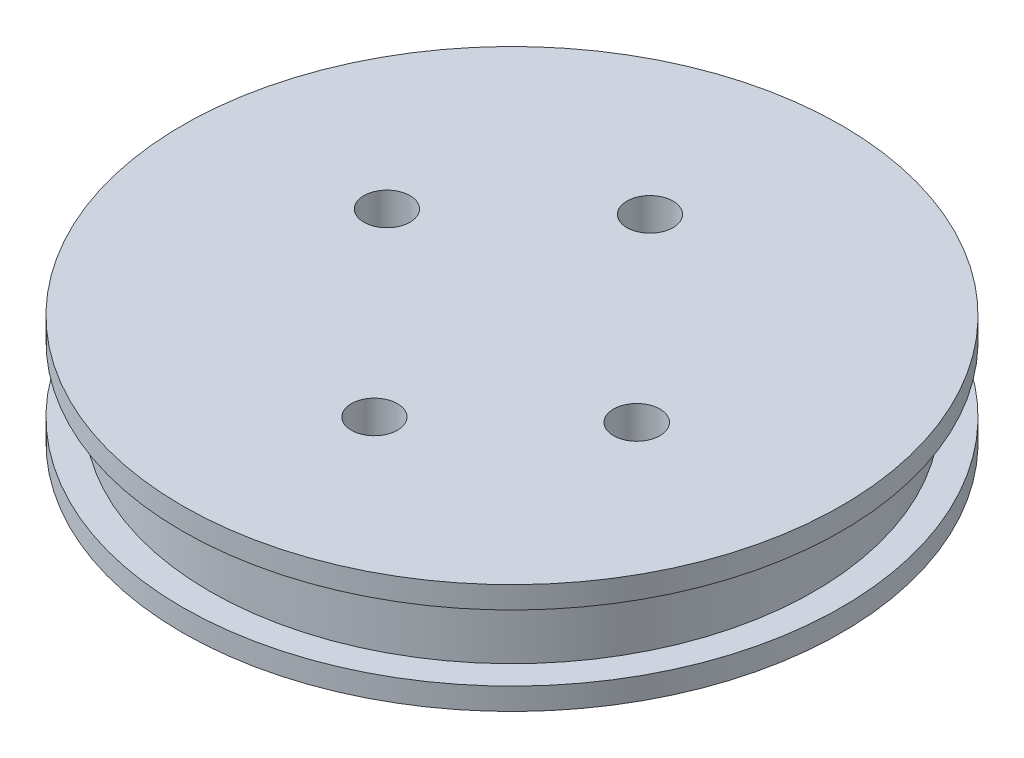
ISO-10303-21;
HEADER;
FILE_DESCRIPTION(('STEP AP214'),'2;1');
FILE_NAME('part.step','',(''),(''),'','','');
FILE_SCHEMA(('AUTOMOTIVE_DESIGN { 1 0 10303 214 1 1 1 1 }'));
ENDSEC;
DATA;
#1=APPLICATION_CONTEXT('core data for automotive mechanical design processes');
#2=APPLICATION_PROTOCOL_DEFINITION('international standard','automotive_design',2000,#1);
#3=PRODUCT_CONTEXT('',#1,'mechanical');
#4=PRODUCT('Part','Part','',(#3));
#5=PRODUCT_RELATED_PRODUCT_CATEGORY('part','',(#4));
#6=PRODUCT_DEFINITION_FORMATION('','',#4);
#7=PRODUCT_DEFINITION_CONTEXT('part definition',#1,'design');
#8=PRODUCT_DEFINITION('design','',#6,#7);
#9=PRODUCT_DEFINITION_SHAPE('','',#8);
#10=(LENGTH_UNIT() NAMED_UNIT(*) SI_UNIT(.MILLI.,.METRE.));
#11=(NAMED_UNIT(*) PLANE_ANGLE_UNIT() SI_UNIT($,.RADIAN.));
#12=(NAMED_UNIT(*) SI_UNIT($,.STERADIAN.) SOLID_ANGLE_UNIT());
#13=UNCERTAINTY_MEASURE_WITH_UNIT(LENGTH_MEASURE(1.E-05),#10,'distance_accuracy_value','');
#14=(GEOMETRIC_REPRESENTATION_CONTEXT(3) GLOBAL_UNCERTAINTY_ASSIGNED_CONTEXT((#13)) GLOBAL_UNIT_ASSIGNED_CONTEXT((#10,
#11,#12)) REPRESENTATION_CONTEXT('',''));
#15=CARTESIAN_POINT('',(0.,0.,0.));
#16=DIRECTION('',(0.,0.,1.));
#17=DIRECTION('',(1.,0.,0.));
#18=AXIS2_PLACEMENT_3D('',#15,#16,#17);
#19=CARTESIAN_POINT('',(0.,6.,0.));
#20=DIRECTION('',(0.,-1.,0.));
#21=DIRECTION('',(0.,0.,-1.));
#22=AXIS2_PLACEMENT_3D('',#19,#20,#21);
#23=CYLINDRICAL_SURFACE('',#22,27.5);
#24=CARTESIAN_POINT('',(0.,6.,0.));
#25=DIRECTION('',(0.,1.,0.));
#26=DIRECTION('',(0.,0.,1.));
#27=AXIS2_PLACEMENT_3D('',#24,#25,#26);
#28=CIRCLE('',#27,27.5);
#29=CARTESIAN_POINT('',(0.,6.,27.5));
#30=VERTEX_POINT('',#29);
#31=EDGE_CURVE('E10',#30,#30,#28,.T.);
#32=ORIENTED_EDGE('',*,*,#31,.F.);
#33=EDGE_LOOP('',(#32));
#34=FACE_BOUND('',#33,.T.);
#35=CARTESIAN_POINT('',(0.,0.,0.));
#36=DIRECTION('',(0.,1.,0.));
#37=DIRECTION('',(0.,0.,1.));
#38=AXIS2_PLACEMENT_3D('',#35,#36,#37);
#39=CIRCLE('',#38,27.5);
#40=CARTESIAN_POINT('',(0.,0.,27.5));
#41=VERTEX_POINT('',#40);
#42=EDGE_CURVE('E45',#41,#41,#39,.T.);
#43=ORIENTED_EDGE('',*,*,#42,.T.);
#44=EDGE_LOOP('',(#43));
#45=FACE_BOUND('',#44,.T.);
#46=ADVANCED_FACE('F42',(#34,#45),#23,.T.);
#47=CARTESIAN_POINT('',(0.,8.,0.));
#48=DIRECTION('',(0.,-1.,0.));
#49=DIRECTION('',(0.,0.,-1.));
#50=AXIS2_PLACEMENT_3D('',#47,#48,#49);
#51=CYLINDRICAL_SURFACE('',#50,30.);
#52=CARTESIAN_POINT('',(0.,8.,0.));
#53=DIRECTION('',(0.,1.,0.));
#54=DIRECTION('',(0.,0.,1.));
#55=AXIS2_PLACEMENT_3D('',#52,#53,#54);
#56=CIRCLE('',#55,30.);
#57=CARTESIAN_POINT('',(0.,8.,30.));
#58=VERTEX_POINT('',#57);
#59=EDGE_CURVE('E50',#58,#58,#56,.T.);
#60=ORIENTED_EDGE('',*,*,#59,.F.);
#61=EDGE_LOOP('',(#60));
#62=FACE_BOUND('',#61,.T.);
#63=CARTESIAN_POINT('',(0.,6.,0.));
#64=DIRECTION('',(0.,1.,0.));
#65=DIRECTION('',(0.,0.,1.));
#66=AXIS2_PLACEMENT_3D('',#63,#64,#65);
#67=CIRCLE('',#66,30.);
#68=CARTESIAN_POINT('',(0.,6.,30.));
#69=VERTEX_POINT('',#68);
#70=EDGE_CURVE('E55',#69,#69,#67,.T.);
#71=ORIENTED_EDGE('',*,*,#70,.T.);
#72=EDGE_LOOP('',(#71));
#73=FACE_BOUND('',#72,.T.);
#74=ADVANCED_FACE('F117',(#62,#73),#51,.T.);
#75=CARTESIAN_POINT('',(0.,8.,0.));
#76=DIRECTION('',(0.,1.,0.));
#77=DIRECTION('',(0.,0.,1.));
#78=AXIS2_PLACEMENT_3D('',#75,#76,#77);
#79=PLANE('',#78);
#80=CARTESIAN_POINT('',(14.0955222521336,8.,2.74250728181813));
#81=DIRECTION('',(0.,1.,0.));
#82=DIRECTION('',(0.,0.,1.));
#83=AXIS2_PLACEMENT_3D('',#80,#81,#82);
#84=CIRCLE('',#83,2.11);
#85=CARTESIAN_POINT('',(14.0955222521336,8.,4.85250728181813));
#86=VERTEX_POINT('',#85);
#87=EDGE_CURVE('E66',#86,#86,#84,.T.);
#88=ORIENTED_EDGE('',*,*,#87,.F.);
#89=EDGE_LOOP('',(#88));
#90=FACE_BOUND('',#89,.T.);
#91=CARTESIAN_POINT('',(1.72684804409641,8.,14.2556336086411));
#92=DIRECTION('',(0.,1.,0.));
#93=DIRECTION('',(0.,0.,1.));
#94=AXIS2_PLACEMENT_3D('',#91,#92,#93);
#95=CIRCLE('',#94,2.1);
#96=CARTESIAN_POINT('',(1.72684804409641,8.,16.3556336086411));
#97=VERTEX_POINT('',#96);
#98=EDGE_CURVE('E73',#97,#97,#95,.T.);
#99=ORIENTED_EDGE('',*,*,#98,.F.);
#100=EDGE_LOOP('',(#99));
#101=FACE_BOUND('',#100,.T.);
#102=CARTESIAN_POINT('',(-14.1007024311199,8.,-2.71574753985426));
#103=DIRECTION('',(0.,1.,0.));
#104=DIRECTION('',(0.,0.,1.));
#105=AXIS2_PLACEMENT_3D('',#102,#103,#104);
#106=CIRCLE('',#105,2.1);
#107=CARTESIAN_POINT('',(-14.1007024311199,8.,-0.615747539854261));
#108=VERTEX_POINT('',#107);
#109=EDGE_CURVE('E77',#108,#108,#106,.T.);
#110=ORIENTED_EDGE('',*,*,#109,.F.);
#111=EDGE_LOOP('',(#110));
#112=FACE_BOUND('',#111,.T.);
#113=CARTESIAN_POINT('',(-1.69978622334955,8.,-14.2588856698596));
#114=DIRECTION('',(0.,1.,0.));
#115=DIRECTION('',(0.,0.,1.));
#116=AXIS2_PLACEMENT_3D('',#113,#114,#115);
#117=CIRCLE('',#116,2.1);
#118=CARTESIAN_POINT('',(-1.69978622334955,8.,-12.1588856698596));
#119=VERTEX_POINT('',#118);
#120=EDGE_CURVE('E81',#119,#119,#117,.T.);
#121=ORIENTED_EDGE('',*,*,#120,.F.);
#122=EDGE_LOOP('',(#121));
#123=FACE_BOUND('',#122,.T.);
#124=ORIENTED_EDGE('',*,*,#59,.T.);
#125=EDGE_LOOP('',(#124));
#126=FACE_BOUND('',#125,.T.);
#127=ADVANCED_FACE('F122',(#90,#101,#112,#123,#126),#79,.T.);
#128=CARTESIAN_POINT('',(0.,6.,0.));
#129=DIRECTION('',(0.,1.,0.));
#130=DIRECTION('',(0.,0.,1.));
#131=AXIS2_PLACEMENT_3D('',#128,#129,#130);
#132=PLANE('',#131);
#133=ORIENTED_EDGE('',*,*,#31,.T.);
#134=EDGE_LOOP('',(#133));
#135=FACE_BOUND('',#134,.T.);
#136=ORIENTED_EDGE('',*,*,#70,.F.);
#137=EDGE_LOOP('',(#136));
#138=FACE_BOUND('',#137,.T.);
#139=ADVANCED_FACE('F138',(#135,#138),#132,.F.);
#140=CARTESIAN_POINT('',(0.,-2.,0.));
#141=DIRECTION('',(0.,1.,0.));
#142=DIRECTION('',(0.,0.,1.));
#143=AXIS2_PLACEMENT_3D('',#140,#141,#142);
#144=CYLINDRICAL_SURFACE('',#143,30.);
#145=CARTESIAN_POINT('',(0.,-2.,0.));
#146=DIRECTION('',(0.,-1.,0.));
#147=DIRECTION('',(0.,0.,-1.));
#148=AXIS2_PLACEMENT_3D('',#145,#146,#147);
#149=CIRCLE('',#148,30.);
#150=CARTESIAN_POINT('',(0.,-2.,-30.));
#151=VERTEX_POINT('',#150);
#152=EDGE_CURVE('E65',#151,#151,#149,.T.);
#153=ORIENTED_EDGE('',*,*,#152,.F.);
#154=EDGE_LOOP('',(#153));
#155=FACE_BOUND('',#154,.T.);
#156=CARTESIAN_POINT('',(0.,0.,0.));
#157=DIRECTION('',(0.,-1.,0.));
#158=DIRECTION('',(0.,0.,-1.));
#159=AXIS2_PLACEMENT_3D('',#156,#157,#158);
#160=CIRCLE('',#159,30.);
#161=CARTESIAN_POINT('',(0.,0.,-30.));
#162=VERTEX_POINT('',#161);
#163=EDGE_CURVE('E61',#162,#162,#160,.T.);
#164=ORIENTED_EDGE('',*,*,#163,.T.);
#165=EDGE_LOOP('',(#164));
#166=FACE_BOUND('',#165,.T.);
#167=ADVANCED_FACE('F136',(#155,#166),#144,.T.);
#168=CARTESIAN_POINT('',(0.,-2.,0.));
#169=DIRECTION('',(0.,-1.,0.));
#170=DIRECTION('',(0.,0.,-1.));
#171=AXIS2_PLACEMENT_3D('',#168,#169,#170);
#172=PLANE('',#171);
#173=CARTESIAN_POINT('',(14.0955222521336,-2.,2.74250728181813));
#174=DIRECTION('',(0.,1.,0.));
#175=DIRECTION('',(0.,0.,1.));
#176=AXIS2_PLACEMENT_3D('',#173,#174,#175);
#177=CIRCLE('',#176,2.11);
#178=CARTESIAN_POINT('',(14.0955222521336,-2.,4.85250728181813));
#179=VERTEX_POINT('',#178);
#180=EDGE_CURVE('E85',#179,#179,#177,.T.);
#181=ORIENTED_EDGE('',*,*,#180,.T.);
#182=EDGE_LOOP('',(#181));
#183=FACE_BOUND('',#182,.T.);
#184=CARTESIAN_POINT('',(1.72684804409641,-2.,14.2556336086411));
#185=DIRECTION('',(0.,1.,0.));
#186=DIRECTION('',(0.,0.,1.));
#187=AXIS2_PLACEMENT_3D('',#184,#185,#186);
#188=CIRCLE('',#187,2.1);
#189=CARTESIAN_POINT('',(1.72684804409641,-2.,16.3556336086411));
#190=VERTEX_POINT('',#189);
#191=EDGE_CURVE('E94',#190,#190,#188,.T.);
#192=ORIENTED_EDGE('',*,*,#191,.T.);
#193=EDGE_LOOP('',(#192));
#194=FACE_BOUND('',#193,.T.);
#195=CARTESIAN_POINT('',(-14.1007024311199,-2.,-2.71574753985426));
#196=DIRECTION('',(0.,1.,0.));
#197=DIRECTION('',(0.,0.,1.));
#198=AXIS2_PLACEMENT_3D('',#195,#196,#197);
#199=CIRCLE('',#198,2.1);
#200=CARTESIAN_POINT('',(-14.1007024311199,-2.,-0.615747539854261));
#201=VERTEX_POINT('',#200);
#202=EDGE_CURVE('E90',#201,#201,#199,.T.);
#203=ORIENTED_EDGE('',*,*,#202,.T.);
#204=EDGE_LOOP('',(#203));
#205=FACE_BOUND('',#204,.T.);
#206=CARTESIAN_POINT('',(-1.69978622334955,-2.,-14.2588856698596));
#207=DIRECTION('',(0.,1.,0.));
#208=DIRECTION('',(0.,0.,1.));
#209=AXIS2_PLACEMENT_3D('',#206,#207,#208);
#210=CIRCLE('',#209,2.1);
#211=CARTESIAN_POINT('',(-1.69978622334955,-2.,-12.1588856698596));
#212=VERTEX_POINT('',#211);
#213=EDGE_CURVE('E86',#212,#212,#210,.T.);
#214=ORIENTED_EDGE('',*,*,#213,.T.);
#215=EDGE_LOOP('',(#214));
#216=FACE_BOUND('',#215,.T.);
#217=ORIENTED_EDGE('',*,*,#152,.T.);
#218=EDGE_LOOP('',(#217));
#219=FACE_BOUND('',#218,.T.);
#220=ADVANCED_FACE('F102',(#183,#194,#205,#216,#219),#172,.T.);
#221=CARTESIAN_POINT('',(0.,0.,0.));
#222=DIRECTION('',(0.,-1.,0.));
#223=DIRECTION('',(0.,0.,-1.));
#224=AXIS2_PLACEMENT_3D('',#221,#222,#223);
#225=PLANE('',#224);
#226=ORIENTED_EDGE('',*,*,#42,.F.);
#227=EDGE_LOOP('',(#226));
#228=FACE_BOUND('',#227,.T.);
#229=ORIENTED_EDGE('',*,*,#163,.F.);
#230=EDGE_LOOP('',(#229));
#231=FACE_BOUND('',#230,.T.);
#232=ADVANCED_FACE('F129',(#228,#231),#225,.F.);
#233=CARTESIAN_POINT('',(-1.69978622334955,-2.,-14.2588856698596));
#234=DIRECTION('',(0.,1.,0.));
#235=DIRECTION('',(0.,0.,1.));
#236=AXIS2_PLACEMENT_3D('',#233,#234,#235);
#237=CYLINDRICAL_SURFACE('',#236,2.1);
#238=ORIENTED_EDGE('',*,*,#120,.T.);
#239=EDGE_LOOP('',(#238));
#240=FACE_BOUND('',#239,.T.);
#241=ORIENTED_EDGE('',*,*,#213,.F.);
#242=EDGE_LOOP('',(#241));
#243=FACE_BOUND('',#242,.T.);
#244=ADVANCED_FACE('F132',(#240,#243),#237,.F.);
#245=CARTESIAN_POINT('',(-14.1007024311199,-2.,-2.71574753985426));
#246=DIRECTION('',(0.,1.,0.));
#247=DIRECTION('',(0.,0.,1.));
#248=AXIS2_PLACEMENT_3D('',#245,#246,#247);
#249=CYLINDRICAL_SURFACE('',#248,2.1);
#250=ORIENTED_EDGE('',*,*,#109,.T.);
#251=EDGE_LOOP('',(#250));
#252=FACE_BOUND('',#251,.T.);
#253=ORIENTED_EDGE('',*,*,#202,.F.);
#254=EDGE_LOOP('',(#253));
#255=FACE_BOUND('',#254,.T.);
#256=ADVANCED_FACE('F113',(#252,#255),#249,.F.);
#257=CARTESIAN_POINT('',(1.72684804409641,-2.,14.2556336086411));
#258=DIRECTION('',(0.,1.,0.));
#259=DIRECTION('',(0.,0.,1.));
#260=AXIS2_PLACEMENT_3D('',#257,#258,#259);
#261=CYLINDRICAL_SURFACE('',#260,2.1);
#262=ORIENTED_EDGE('',*,*,#98,.T.);
#263=EDGE_LOOP('',(#262));
#264=FACE_BOUND('',#263,.T.);
#265=ORIENTED_EDGE('',*,*,#191,.F.);
#266=EDGE_LOOP('',(#265));
#267=FACE_BOUND('',#266,.T.);
#268=ADVANCED_FACE('F107',(#264,#267),#261,.F.);
#269=CARTESIAN_POINT('',(14.0955222521336,-2.,2.74250728181813));
#270=DIRECTION('',(0.,1.,0.));
#271=DIRECTION('',(0.,0.,1.));
#272=AXIS2_PLACEMENT_3D('',#269,#270,#271);
#273=CYLINDRICAL_SURFACE('',#272,2.11);
#274=ORIENTED_EDGE('',*,*,#87,.T.);
#275=EDGE_LOOP('',(#274));
#276=FACE_BOUND('',#275,.T.);
#277=ORIENTED_EDGE('',*,*,#180,.F.);
#278=EDGE_LOOP('',(#277));
#279=FACE_BOUND('',#278,.T.);
#280=ADVANCED_FACE('F105',(#276,#279),#273,.F.);
#281=CLOSED_SHELL('',(#46,#74,#127,#139,#167,#220,#232,#244,#256,#268,#280));
#282=MANIFOLD_SOLID_BREP('B2',#281);
#283=ADVANCED_BREP_SHAPE_REPRESENTATION('',(#18,#282),#14);
#284=SHAPE_DEFINITION_REPRESENTATION(#9,#283);
ENDSEC;
END-ISO-10303-21;
